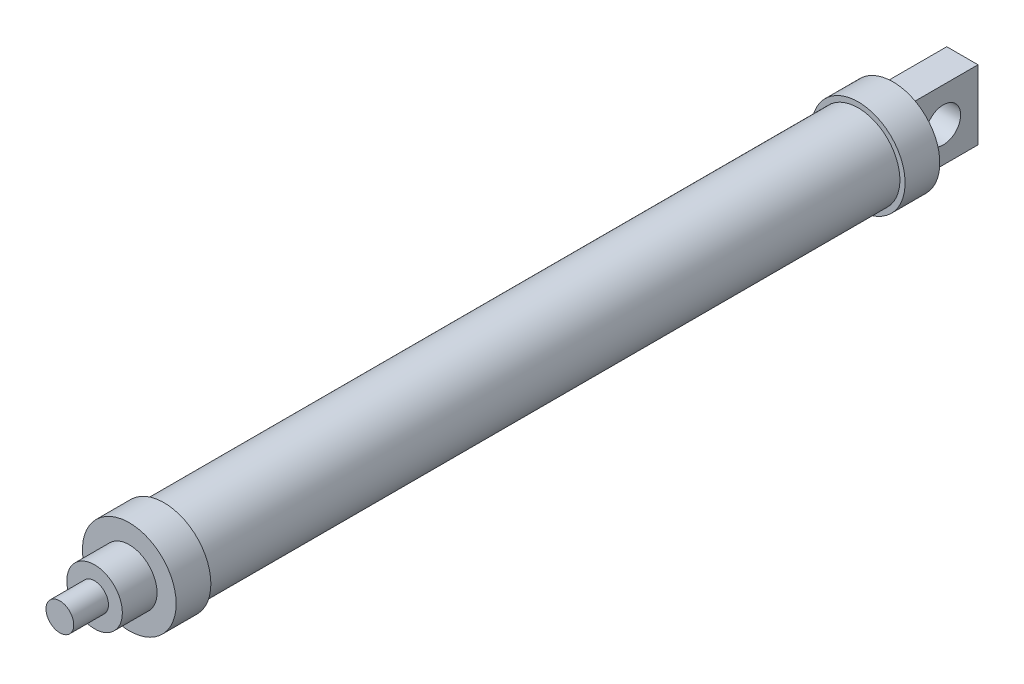
ISO-10303-21;
HEADER;
FILE_DESCRIPTION(('STEP AP214'),'2;1');
FILE_NAME('part.step','',(''),(''),'','','');
FILE_SCHEMA(('AUTOMOTIVE_DESIGN { 1 0 10303 214 1 1 1 1 }'));
ENDSEC;
DATA;
#1=APPLICATION_CONTEXT('core data for automotive mechanical design processes');
#2=APPLICATION_PROTOCOL_DEFINITION('international standard','automotive_design',2000,#1);
#3=PRODUCT_CONTEXT('',#1,'mechanical');
#4=PRODUCT('Part','Part','',(#3));
#5=PRODUCT_RELATED_PRODUCT_CATEGORY('part','',(#4));
#6=PRODUCT_DEFINITION_FORMATION('','',#4);
#7=PRODUCT_DEFINITION_CONTEXT('part definition',#1,'design');
#8=PRODUCT_DEFINITION('design','',#6,#7);
#9=PRODUCT_DEFINITION_SHAPE('','',#8);
#10=(LENGTH_UNIT() NAMED_UNIT(*) SI_UNIT(.MILLI.,.METRE.));
#11=(NAMED_UNIT(*) PLANE_ANGLE_UNIT() SI_UNIT($,.RADIAN.));
#12=(NAMED_UNIT(*) SI_UNIT($,.STERADIAN.) SOLID_ANGLE_UNIT());
#13=UNCERTAINTY_MEASURE_WITH_UNIT(LENGTH_MEASURE(1.E-05),#10,'distance_accuracy_value','');
#14=(GEOMETRIC_REPRESENTATION_CONTEXT(3) GLOBAL_UNCERTAINTY_ASSIGNED_CONTEXT((#13)) GLOBAL_UNIT_ASSIGNED_CONTEXT((#10,
#11,#12)) REPRESENTATION_CONTEXT('',''));
#15=CARTESIAN_POINT('',(0.,0.,0.));
#16=DIRECTION('',(0.,0.,1.));
#17=DIRECTION('',(1.,0.,0.));
#18=AXIS2_PLACEMENT_3D('',#15,#16,#17);
#19=CARTESIAN_POINT('',(0.,0.,10.));
#20=DIRECTION('',(0.,0.,-1.));
#21=DIRECTION('',(-1.,0.,0.));
#22=AXIS2_PLACEMENT_3D('',#19,#20,#21);
#23=CYLINDRICAL_SURFACE('',#22,13.5);
#24=CARTESIAN_POINT('',(0.,0.,10.));
#25=DIRECTION('',(0.,0.,1.));
#26=DIRECTION('',(1.,0.,0.));
#27=AXIS2_PLACEMENT_3D('',#24,#25,#26);
#28=CIRCLE('',#27,13.5);
#29=CARTESIAN_POINT('',(13.5,0.,10.));
#30=VERTEX_POINT('',#29);
#31=EDGE_CURVE('E120',#30,#30,#28,.T.);
#32=ORIENTED_EDGE('',*,*,#31,.F.);
#33=EDGE_LOOP('',(#32));
#34=FACE_BOUND('',#33,.T.);
#35=CARTESIAN_POINT('',(0.,0.,0.));
#36=DIRECTION('',(0.,0.,1.));
#37=DIRECTION('',(1.,0.,0.));
#38=AXIS2_PLACEMENT_3D('',#35,#36,#37);
#39=CIRCLE('',#38,13.5);
#40=CARTESIAN_POINT('',(13.5,0.,0.));
#41=VERTEX_POINT('',#40);
#42=EDGE_CURVE('E117',#41,#41,#39,.T.);
#43=ORIENTED_EDGE('',*,*,#42,.T.);
#44=EDGE_LOOP('',(#43));
#45=FACE_BOUND('',#44,.T.);
#46=ADVANCED_FACE('F35',(#34,#45),#23,.T.);
#47=CARTESIAN_POINT('',(0.,0.,10.));
#48=DIRECTION('',(0.,0.,1.));
#49=DIRECTION('',(1.,0.,0.));
#50=AXIS2_PLACEMENT_3D('',#47,#48,#49);
#51=PLANE('',#50);
#52=CARTESIAN_POINT('',(0.,0.,10.));
#53=DIRECTION('',(0.,0.,1.));
#54=DIRECTION('',(1.,0.,0.));
#55=AXIS2_PLACEMENT_3D('',#52,#53,#54);
#56=CIRCLE('',#55,8.);
#57=CARTESIAN_POINT('',(8.,0.,10.));
#58=VERTEX_POINT('',#57);
#59=EDGE_CURVE('E114',#58,#58,#56,.T.);
#60=ORIENTED_EDGE('',*,*,#59,.F.);
#61=EDGE_LOOP('',(#60));
#62=FACE_BOUND('',#61,.T.);
#63=ORIENTED_EDGE('',*,*,#31,.T.);
#64=EDGE_LOOP('',(#63));
#65=FACE_BOUND('',#64,.T.);
#66=ADVANCED_FACE('F129',(#62,#65),#51,.T.);
#67=CARTESIAN_POINT('',(0.,0.,0.));
#68=DIRECTION('',(0.,0.,1.));
#69=DIRECTION('',(1.,0.,0.));
#70=AXIS2_PLACEMENT_3D('',#67,#68,#69);
#71=PLANE('',#70);
#72=CARTESIAN_POINT('',(0.,0.,0.));
#73=DIRECTION('',(0.,0.,-1.));
#74=DIRECTION('',(-1.,0.,0.));
#75=AXIS2_PLACEMENT_3D('',#72,#73,#74);
#76=CIRCLE('',#75,12.);
#77=CARTESIAN_POINT('',(-12.,0.,0.));
#78=VERTEX_POINT('',#77);
#79=EDGE_CURVE('E43',#78,#78,#76,.T.);
#80=ORIENTED_EDGE('',*,*,#79,.F.);
#81=EDGE_LOOP('',(#80));
#82=FACE_BOUND('',#81,.T.);
#83=ORIENTED_EDGE('',*,*,#42,.F.);
#84=EDGE_LOOP('',(#83));
#85=FACE_BOUND('',#84,.T.);
#86=ADVANCED_FACE('F126',(#82,#85),#71,.F.);
#87=CARTESIAN_POINT('',(0.,0.,20.));
#88=DIRECTION('',(0.,0.,-1.));
#89=DIRECTION('',(-1.,0.,0.));
#90=AXIS2_PLACEMENT_3D('',#87,#88,#89);
#91=CYLINDRICAL_SURFACE('',#90,8.);
#92=CARTESIAN_POINT('',(0.,0.,20.));
#93=DIRECTION('',(0.,0.,1.));
#94=DIRECTION('',(1.,0.,0.));
#95=AXIS2_PLACEMENT_3D('',#92,#93,#94);
#96=CIRCLE('',#95,8.);
#97=CARTESIAN_POINT('',(8.,0.,20.));
#98=VERTEX_POINT('',#97);
#99=EDGE_CURVE('E111',#98,#98,#96,.T.);
#100=ORIENTED_EDGE('',*,*,#99,.F.);
#101=EDGE_LOOP('',(#100));
#102=FACE_BOUND('',#101,.T.);
#103=ORIENTED_EDGE('',*,*,#59,.T.);
#104=EDGE_LOOP('',(#103));
#105=FACE_BOUND('',#104,.T.);
#106=ADVANCED_FACE('F128',(#102,#105),#91,.T.);
#107=CARTESIAN_POINT('',(0.,0.,20.));
#108=DIRECTION('',(0.,0.,1.));
#109=DIRECTION('',(1.,0.,0.));
#110=AXIS2_PLACEMENT_3D('',#107,#108,#109);
#111=PLANE('',#110);
#112=CARTESIAN_POINT('',(0.,0.,20.));
#113=DIRECTION('',(0.,0.,1.));
#114=DIRECTION('',(1.,0.,0.));
#115=AXIS2_PLACEMENT_3D('',#112,#113,#114);
#116=CIRCLE('',#115,4.);
#117=CARTESIAN_POINT('',(4.,0.,20.));
#118=VERTEX_POINT('',#117);
#119=EDGE_CURVE('E11',#118,#118,#116,.T.);
#120=ORIENTED_EDGE('',*,*,#119,.F.);
#121=EDGE_LOOP('',(#120));
#122=FACE_BOUND('',#121,.T.);
#123=ORIENTED_EDGE('',*,*,#99,.T.);
#124=EDGE_LOOP('',(#123));
#125=FACE_BOUND('',#124,.T.);
#126=ADVANCED_FACE('F135',(#122,#125),#111,.T.);
#127=CARTESIAN_POINT('',(0.,0.,-200.));
#128=DIRECTION('',(0.,0.,1.));
#129=DIRECTION('',(1.,0.,0.));
#130=AXIS2_PLACEMENT_3D('',#127,#128,#129);
#131=CYLINDRICAL_SURFACE('',#130,12.);
#132=CARTESIAN_POINT('',(0.,0.,-200.));
#133=DIRECTION('',(0.,0.,-1.));
#134=DIRECTION('',(-1.,0.,0.));
#135=AXIS2_PLACEMENT_3D('',#132,#133,#134);
#136=CIRCLE('',#135,12.);
#137=CARTESIAN_POINT('',(-12.,0.,-200.));
#138=VERTEX_POINT('',#137);
#139=EDGE_CURVE('E107',#138,#138,#136,.T.);
#140=ORIENTED_EDGE('',*,*,#139,.F.);
#141=EDGE_LOOP('',(#140));
#142=FACE_BOUND('',#141,.T.);
#143=ORIENTED_EDGE('',*,*,#79,.T.);
#144=EDGE_LOOP('',(#143));
#145=FACE_BOUND('',#144,.T.);
#146=ADVANCED_FACE('F168',(#142,#145),#131,.T.);
#147=CARTESIAN_POINT('',(0.,0.,-210.));
#148=DIRECTION('',(0.,0.,1.));
#149=DIRECTION('',(1.,0.,0.));
#150=AXIS2_PLACEMENT_3D('',#147,#148,#149);
#151=CYLINDRICAL_SURFACE('',#150,13.5);
#152=CARTESIAN_POINT('',(0.,0.,-210.));
#153=DIRECTION('',(0.,0.,-1.));
#154=DIRECTION('',(-1.,0.,0.));
#155=AXIS2_PLACEMENT_3D('',#152,#153,#154);
#156=CIRCLE('',#155,13.5);
#157=CARTESIAN_POINT('',(-13.5,0.,-210.));
#158=VERTEX_POINT('',#157);
#159=EDGE_CURVE('E100',#158,#158,#156,.T.);
#160=ORIENTED_EDGE('',*,*,#159,.F.);
#161=EDGE_LOOP('',(#160));
#162=FACE_BOUND('',#161,.T.);
#163=CARTESIAN_POINT('',(0.,0.,-200.));
#164=DIRECTION('',(0.,0.,-1.));
#165=DIRECTION('',(-1.,0.,0.));
#166=AXIS2_PLACEMENT_3D('',#163,#164,#165);
#167=CIRCLE('',#166,13.5);
#168=CARTESIAN_POINT('',(-13.5,0.,-200.));
#169=VERTEX_POINT('',#168);
#170=EDGE_CURVE('E97',#169,#169,#167,.T.);
#171=ORIENTED_EDGE('',*,*,#170,.T.);
#172=EDGE_LOOP('',(#171));
#173=FACE_BOUND('',#172,.T.);
#174=ADVANCED_FACE('F173',(#162,#173),#151,.T.);
#175=CARTESIAN_POINT('',(0.,0.,-210.));
#176=DIRECTION('',(0.,0.,-1.));
#177=DIRECTION('',(-1.,0.,0.));
#178=AXIS2_PLACEMENT_3D('',#175,#176,#177);
#179=PLANE('',#178);
#180=DIRECTION('',(0.,-1.,0.));
#181=VECTOR('',#180,1.);
#182=CARTESIAN_POINT('',(4.5,-10.,-210.));
#183=LINE('',#182,#181);
#184=CARTESIAN_POINT('',(4.5,10.,-210.));
#185=VERTEX_POINT('',#184);
#186=CARTESIAN_POINT('',(4.5,-10.,-210.));
#187=VERTEX_POINT('',#186);
#188=EDGE_CURVE('E51',#185,#187,#183,.T.);
#189=ORIENTED_EDGE('',*,*,#188,.F.);
#190=DIRECTION('',(1.,0.,0.));
#191=VECTOR('',#190,1.);
#192=CARTESIAN_POINT('',(-4.5,10.,-210.));
#193=LINE('',#192,#191);
#194=CARTESIAN_POINT('',(-4.5,10.,-210.));
#195=VERTEX_POINT('',#194);
#196=EDGE_CURVE('E55',#195,#185,#193,.T.);
#197=ORIENTED_EDGE('',*,*,#196,.F.);
#198=DIRECTION('',(0.,1.,0.));
#199=VECTOR('',#198,1.);
#200=CARTESIAN_POINT('',(-4.5,-10.,-210.));
#201=LINE('',#200,#199);
#202=CARTESIAN_POINT('',(-4.5,-10.,-210.));
#203=VERTEX_POINT('',#202);
#204=EDGE_CURVE('E302',#203,#195,#201,.T.);
#205=ORIENTED_EDGE('',*,*,#204,.F.);
#206=DIRECTION('',(-1.,0.,0.));
#207=VECTOR('',#206,1.);
#208=CARTESIAN_POINT('',(-4.5,-10.,-210.));
#209=LINE('',#208,#207);
#210=EDGE_CURVE('E300',#187,#203,#209,.T.);
#211=ORIENTED_EDGE('',*,*,#210,.F.);
#212=EDGE_LOOP('',(#189,#197,#205,#211));
#213=FACE_BOUND('',#212,.T.);
#214=ORIENTED_EDGE('',*,*,#159,.T.);
#215=EDGE_LOOP('',(#214));
#216=FACE_BOUND('',#215,.T.);
#217=ADVANCED_FACE('F183',(#213,#216),#179,.T.);
#218=CARTESIAN_POINT('',(0.,0.,-200.));
#219=DIRECTION('',(0.,0.,-1.));
#220=DIRECTION('',(-1.,0.,0.));
#221=AXIS2_PLACEMENT_3D('',#218,#219,#220);
#222=PLANE('',#221);
#223=ORIENTED_EDGE('',*,*,#139,.T.);
#224=EDGE_LOOP('',(#223));
#225=FACE_BOUND('',#224,.T.);
#226=ORIENTED_EDGE('',*,*,#170,.F.);
#227=EDGE_LOOP('',(#226));
#228=FACE_BOUND('',#227,.T.);
#229=ADVANCED_FACE('F191',(#225,#228),#222,.F.);
#230=CARTESIAN_POINT('',(4.5,-10.,-230.));
#231=DIRECTION('',(-1.,0.,0.));
#232=DIRECTION('',(0.,-1.,0.));
#233=AXIS2_PLACEMENT_3D('',#230,#231,#232);
#234=PLANE('',#233);
#235=CARTESIAN_POINT('',(4.5,0.,-220.));
#236=DIRECTION('',(1.,0.,0.));
#237=DIRECTION('',(0.,1.,0.));
#238=AXIS2_PLACEMENT_3D('',#235,#236,#237);
#239=CIRCLE('',#238,4.99999999999999);
#240=CARTESIAN_POINT('',(4.5,4.99999999999999,-220.));
#241=VERTEX_POINT('',#240);
#242=EDGE_CURVE('E291',#241,#241,#239,.T.);
#243=ORIENTED_EDGE('',*,*,#242,.F.);
#244=EDGE_LOOP('',(#243));
#245=FACE_BOUND('',#244,.T.);
#246=ORIENTED_EDGE('',*,*,#188,.T.);
#247=DIRECTION('',(0.,0.,1.));
#248=VECTOR('',#247,1.);
#249=CARTESIAN_POINT('',(4.5,-10.,-230.));
#250=LINE('',#249,#248);
#251=CARTESIAN_POINT('',(4.5,-10.,-230.));
#252=VERTEX_POINT('',#251);
#253=EDGE_CURVE('E80',#252,#187,#250,.T.);
#254=ORIENTED_EDGE('',*,*,#253,.F.);
#255=DIRECTION('',(0.,-1.,0.));
#256=VECTOR('',#255,1.);
#257=CARTESIAN_POINT('',(4.5,-10.,-230.));
#258=LINE('',#257,#256);
#259=CARTESIAN_POINT('',(4.5,10.,-230.));
#260=VERTEX_POINT('',#259);
#261=EDGE_CURVE('E86',#260,#252,#258,.T.);
#262=ORIENTED_EDGE('',*,*,#261,.F.);
#263=DIRECTION('',(0.,0.,1.));
#264=VECTOR('',#263,1.);
#265=CARTESIAN_POINT('',(4.5,10.,-230.));
#266=LINE('',#265,#264);
#267=EDGE_CURVE('E298',#260,#185,#266,.T.);
#268=ORIENTED_EDGE('',*,*,#267,.T.);
#269=EDGE_LOOP('',(#246,#254,#262,#268));
#270=FACE_BOUND('',#269,.T.);
#271=ADVANCED_FACE('F96',(#245,#270),#234,.F.);
#272=CARTESIAN_POINT('',(-4.5,-10.,-230.));
#273=DIRECTION('',(0.,1.,0.));
#274=DIRECTION('',(-1.,0.,0.));
#275=AXIS2_PLACEMENT_3D('',#272,#273,#274);
#276=PLANE('',#275);
#277=ORIENTED_EDGE('',*,*,#210,.T.);
#278=DIRECTION('',(0.,0.,1.));
#279=VECTOR('',#278,1.);
#280=CARTESIAN_POINT('',(-4.5,-10.,-230.));
#281=LINE('',#280,#279);
#282=CARTESIAN_POINT('',(-4.5,-10.,-230.));
#283=VERTEX_POINT('',#282);
#284=EDGE_CURVE('E82',#283,#203,#281,.T.);
#285=ORIENTED_EDGE('',*,*,#284,.F.);
#286=DIRECTION('',(-1.,0.,0.));
#287=VECTOR('',#286,1.);
#288=CARTESIAN_POINT('',(-4.5,-10.,-230.));
#289=LINE('',#288,#287);
#290=EDGE_CURVE('E75',#252,#283,#289,.T.);
#291=ORIENTED_EDGE('',*,*,#290,.F.);
#292=ORIENTED_EDGE('',*,*,#253,.T.);
#293=EDGE_LOOP('',(#277,#285,#291,#292));
#294=FACE_BOUND('',#293,.T.);
#295=ADVANCED_FACE('F78',(#294),#276,.F.);
#296=CARTESIAN_POINT('',(-4.5,-10.,-230.));
#297=DIRECTION('',(1.,0.,0.));
#298=DIRECTION('',(0.,0.,-1.));
#299=AXIS2_PLACEMENT_3D('',#296,#297,#298);
#300=PLANE('',#299);
#301=CARTESIAN_POINT('',(-4.5,0.,-220.));
#302=DIRECTION('',(1.,0.,0.));
#303=DIRECTION('',(0.,0.,-1.));
#304=AXIS2_PLACEMENT_3D('',#301,#302,#303);
#305=CIRCLE('',#304,4.99999999999999);
#306=CARTESIAN_POINT('',(-4.5,0.,-225.));
#307=VERTEX_POINT('',#306);
#308=EDGE_CURVE('E38',#307,#307,#305,.T.);
#309=ORIENTED_EDGE('',*,*,#308,.T.);
#310=EDGE_LOOP('',(#309));
#311=FACE_BOUND('',#310,.T.);
#312=ORIENTED_EDGE('',*,*,#204,.T.);
#313=DIRECTION('',(0.,0.,1.));
#314=VECTOR('',#313,1.);
#315=CARTESIAN_POINT('',(-4.5,10.,-230.));
#316=LINE('',#315,#314);
#317=CARTESIAN_POINT('',(-4.5,10.,-230.));
#318=VERTEX_POINT('',#317);
#319=EDGE_CURVE('E102',#318,#195,#316,.T.);
#320=ORIENTED_EDGE('',*,*,#319,.F.);
#321=DIRECTION('',(0.,1.,0.));
#322=VECTOR('',#321,1.);
#323=CARTESIAN_POINT('',(-4.5,-10.,-230.));
#324=LINE('',#323,#322);
#325=EDGE_CURVE('E85',#283,#318,#324,.T.);
#326=ORIENTED_EDGE('',*,*,#325,.F.);
#327=ORIENTED_EDGE('',*,*,#284,.T.);
#328=EDGE_LOOP('',(#312,#320,#326,#327));
#329=FACE_BOUND('',#328,.T.);
#330=ADVANCED_FACE('F213',(#311,#329),#300,.F.);
#331=CARTESIAN_POINT('',(-4.5,10.,-230.));
#332=DIRECTION('',(0.,-1.,0.));
#333=DIRECTION('',(0.,0.,-1.));
#334=AXIS2_PLACEMENT_3D('',#331,#332,#333);
#335=PLANE('',#334);
#336=ORIENTED_EDGE('',*,*,#196,.T.);
#337=ORIENTED_EDGE('',*,*,#267,.F.);
#338=DIRECTION('',(1.,0.,0.));
#339=VECTOR('',#338,1.);
#340=CARTESIAN_POINT('',(-4.5,10.,-230.));
#341=LINE('',#340,#339);
#342=EDGE_CURVE('E91',#318,#260,#341,.T.);
#343=ORIENTED_EDGE('',*,*,#342,.F.);
#344=ORIENTED_EDGE('',*,*,#319,.T.);
#345=EDGE_LOOP('',(#336,#337,#343,#344));
#346=FACE_BOUND('',#345,.T.);
#347=ADVANCED_FACE('F220',(#346),#335,.F.);
#348=CARTESIAN_POINT('',(0.,0.,-230.));
#349=DIRECTION('',(0.,0.,-1.));
#350=DIRECTION('',(-1.,0.,0.));
#351=AXIS2_PLACEMENT_3D('',#348,#349,#350);
#352=PLANE('',#351);
#353=ORIENTED_EDGE('',*,*,#261,.T.);
#354=ORIENTED_EDGE('',*,*,#290,.T.);
#355=ORIENTED_EDGE('',*,*,#325,.T.);
#356=ORIENTED_EDGE('',*,*,#342,.T.);
#357=EDGE_LOOP('',(#353,#354,#355,#356));
#358=FACE_BOUND('',#357,.T.);
#359=ADVANCED_FACE('F89',(#358),#352,.T.);
#360=CARTESIAN_POINT('',(-15.5,0.,-220.));
#361=DIRECTION('',(1.,0.,0.));
#362=DIRECTION('',(0.,1.,0.));
#363=AXIS2_PLACEMENT_3D('',#360,#361,#362);
#364=CYLINDRICAL_SURFACE('',#363,4.99999999999999);
#365=ORIENTED_EDGE('',*,*,#242,.T.);
#366=EDGE_LOOP('',(#365));
#367=FACE_BOUND('',#366,.T.);
#368=ORIENTED_EDGE('',*,*,#308,.F.);
#369=EDGE_LOOP('',(#368));
#370=FACE_BOUND('',#369,.T.);
#371=ADVANCED_FACE('F234',(#367,#370),#364,.F.);
#372=CARTESIAN_POINT('',(0.,0.,30.));
#373=DIRECTION('',(0.,0.,-1.));
#374=DIRECTION('',(-1.,0.,0.));
#375=AXIS2_PLACEMENT_3D('',#372,#373,#374);
#376=CYLINDRICAL_SURFACE('',#375,4.);
#377=CARTESIAN_POINT('',(0.,0.,30.));
#378=DIRECTION('',(0.,0.,1.));
#379=DIRECTION('',(1.,0.,0.));
#380=AXIS2_PLACEMENT_3D('',#377,#378,#379);
#381=CIRCLE('',#380,4.);
#382=CARTESIAN_POINT('',(4.,0.,30.));
#383=VERTEX_POINT('',#382);
#384=EDGE_CURVE('E290',#383,#383,#381,.T.);
#385=ORIENTED_EDGE('',*,*,#384,.F.);
#386=EDGE_LOOP('',(#385));
#387=FACE_BOUND('',#386,.T.);
#388=ORIENTED_EDGE('',*,*,#119,.T.);
#389=EDGE_LOOP('',(#388));
#390=FACE_BOUND('',#389,.T.);
#391=ADVANCED_FACE('F257',(#387,#390),#376,.T.);
#392=CARTESIAN_POINT('',(0.,0.,30.));
#393=DIRECTION('',(0.,0.,1.));
#394=DIRECTION('',(1.,0.,0.));
#395=AXIS2_PLACEMENT_3D('',#392,#393,#394);
#396=PLANE('',#395);
#397=ORIENTED_EDGE('',*,*,#384,.T.);
#398=EDGE_LOOP('',(#397));
#399=FACE_BOUND('',#398,.T.);
#400=ADVANCED_FACE('F274',(#399),#396,.T.);
#401=CLOSED_SHELL('',(#46,#66,#86,#106,#126,#146,#174,#217,#229,#271,#295,#330,#347,#359,#371,
#391,#400));
#402=MANIFOLD_SOLID_BREP('B2',#401);
#403=ADVANCED_BREP_SHAPE_REPRESENTATION('',(#18,#402),#14);
#404=SHAPE_DEFINITION_REPRESENTATION(#9,#403);
ENDSEC;
END-ISO-10303-21;
